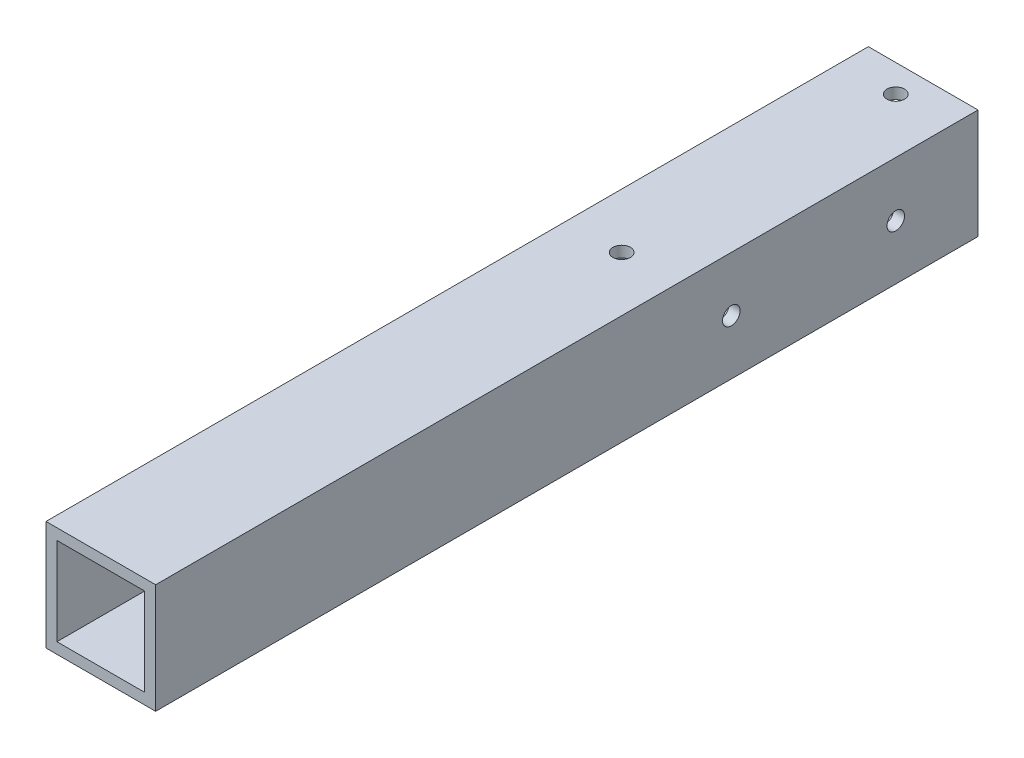
ISO-10303-21;
HEADER;
FILE_DESCRIPTION(('STEP AP214'),'2;1');
FILE_NAME('part.step','',(''),(''),'','','');
FILE_SCHEMA(('AUTOMOTIVE_DESIGN { 1 0 10303 214 1 1 1 1 }'));
ENDSEC;
DATA;
#1=APPLICATION_CONTEXT('core data for automotive mechanical design processes');
#2=APPLICATION_PROTOCOL_DEFINITION('international standard','automotive_design',2000,#1);
#3=PRODUCT_CONTEXT('',#1,'mechanical');
#4=PRODUCT('Part','Part','',(#3));
#5=PRODUCT_RELATED_PRODUCT_CATEGORY('part','',(#4));
#6=PRODUCT_DEFINITION_FORMATION('','',#4);
#7=PRODUCT_DEFINITION_CONTEXT('part definition',#1,'design');
#8=PRODUCT_DEFINITION('design','',#6,#7);
#9=PRODUCT_DEFINITION_SHAPE('','',#8);
#10=(LENGTH_UNIT() NAMED_UNIT(*) SI_UNIT(.MILLI.,.METRE.));
#11=(NAMED_UNIT(*) PLANE_ANGLE_UNIT() SI_UNIT($,.RADIAN.));
#12=(NAMED_UNIT(*) SI_UNIT($,.STERADIAN.) SOLID_ANGLE_UNIT());
#13=UNCERTAINTY_MEASURE_WITH_UNIT(LENGTH_MEASURE(1.E-05),#10,'distance_accuracy_value','');
#14=(GEOMETRIC_REPRESENTATION_CONTEXT(3) GLOBAL_UNCERTAINTY_ASSIGNED_CONTEXT((#13)) GLOBAL_UNIT_ASSIGNED_CONTEXT((#10,
#11,#12)) REPRESENTATION_CONTEXT('',''));
#15=CARTESIAN_POINT('',(0.,0.,0.));
#16=DIRECTION('',(0.,0.,1.));
#17=DIRECTION('',(1.,0.,0.));
#18=AXIS2_PLACEMENT_3D('',#15,#16,#17);
#19=CARTESIAN_POINT('',(0.,0.,150.));
#20=DIRECTION('',(0.,0.,1.));
#21=DIRECTION('',(1.,0.,0.));
#22=AXIS2_PLACEMENT_3D('',#19,#20,#21);
#23=PLANE('',#22);
#24=DIRECTION('',(0.,1.,0.));
#25=VECTOR('',#24,1.);
#26=CARTESIAN_POINT('',(10.,10.,150.));
#27=LINE('',#26,#25);
#28=CARTESIAN_POINT('',(10.,-10.,150.));
#29=VERTEX_POINT('',#28);
#30=CARTESIAN_POINT('',(10.,10.,150.));
#31=VERTEX_POINT('',#30);
#32=EDGE_CURVE('E138',#29,#31,#27,.T.);
#33=ORIENTED_EDGE('',*,*,#32,.T.);
#34=DIRECTION('',(-1.,0.,0.));
#35=VECTOR('',#34,1.);
#36=CARTESIAN_POINT('',(-10.,10.,150.));
#37=LINE('',#36,#35);
#38=CARTESIAN_POINT('',(-10.,10.,150.));
#39=VERTEX_POINT('',#38);
#40=EDGE_CURVE('E141',#31,#39,#37,.T.);
#41=ORIENTED_EDGE('',*,*,#40,.T.);
#42=DIRECTION('',(0.,-1.,0.));
#43=VECTOR('',#42,1.);
#44=CARTESIAN_POINT('',(-10.,10.,150.));
#45=LINE('',#44,#43);
#46=CARTESIAN_POINT('',(-10.,-10.,150.));
#47=VERTEX_POINT('',#46);
#48=EDGE_CURVE('E144',#39,#47,#45,.T.);
#49=ORIENTED_EDGE('',*,*,#48,.T.);
#50=DIRECTION('',(1.,0.,0.));
#51=VECTOR('',#50,1.);
#52=CARTESIAN_POINT('',(-10.,-10.,150.));
#53=LINE('',#52,#51);
#54=EDGE_CURVE('E146',#47,#29,#53,.T.);
#55=ORIENTED_EDGE('',*,*,#54,.T.);
#56=EDGE_LOOP('',(#33,#41,#49,#55));
#57=FACE_BOUND('',#56,.T.);
#58=DIRECTION('',(0.,-1.,0.));
#59=VECTOR('',#58,1.);
#60=CARTESIAN_POINT('',(-8.,8.,150.));
#61=LINE('',#60,#59);
#62=CARTESIAN_POINT('',(-8.,8.,150.));
#63=VERTEX_POINT('',#62);
#64=CARTESIAN_POINT('',(-8.,-7.99999999999999,150.));
#65=VERTEX_POINT('',#64);
#66=EDGE_CURVE('E108',#63,#65,#61,.T.);
#67=ORIENTED_EDGE('',*,*,#66,.F.);
#68=DIRECTION('',(-1.,0.,0.));
#69=VECTOR('',#68,1.);
#70=CARTESIAN_POINT('',(-8.,8.,150.));
#71=LINE('',#70,#69);
#72=CARTESIAN_POINT('',(8.,8.,150.));
#73=VERTEX_POINT('',#72);
#74=EDGE_CURVE('E100',#73,#63,#71,.T.);
#75=ORIENTED_EDGE('',*,*,#74,.F.);
#76=DIRECTION('',(0.,1.,0.));
#77=VECTOR('',#76,1.);
#78=CARTESIAN_POINT('',(8.,8.,150.));
#79=LINE('',#78,#77);
#80=CARTESIAN_POINT('',(8.,-7.99999999999999,150.));
#81=VERTEX_POINT('',#80);
#82=EDGE_CURVE('E122',#81,#73,#79,.T.);
#83=ORIENTED_EDGE('',*,*,#82,.F.);
#84=DIRECTION('',(1.,0.,0.));
#85=VECTOR('',#84,1.);
#86=CARTESIAN_POINT('',(-8.,-7.99999999999999,150.));
#87=LINE('',#86,#85);
#88=EDGE_CURVE('E120',#65,#81,#87,.T.);
#89=ORIENTED_EDGE('',*,*,#88,.F.);
#90=EDGE_LOOP('',(#67,#75,#83,#89));
#91=FACE_BOUND('',#90,.T.);
#92=ADVANCED_FACE('F33',(#57,#91),#23,.T.);
#93=CARTESIAN_POINT('',(0.,0.,0.));
#94=DIRECTION('',(0.,0.,1.));
#95=DIRECTION('',(1.,0.,0.));
#96=AXIS2_PLACEMENT_3D('',#93,#94,#95);
#97=PLANE('',#96);
#98=DIRECTION('',(0.,1.,0.));
#99=VECTOR('',#98,1.);
#100=CARTESIAN_POINT('',(10.,10.,0.));
#101=LINE('',#100,#99);
#102=CARTESIAN_POINT('',(10.,-10.,0.));
#103=VERTEX_POINT('',#102);
#104=CARTESIAN_POINT('',(10.,10.,0.));
#105=VERTEX_POINT('',#104);
#106=EDGE_CURVE('E116',#103,#105,#101,.T.);
#107=ORIENTED_EDGE('',*,*,#106,.F.);
#108=DIRECTION('',(1.,0.,0.));
#109=VECTOR('',#108,1.);
#110=CARTESIAN_POINT('',(-10.,-10.,0.));
#111=LINE('',#110,#109);
#112=CARTESIAN_POINT('',(-10.,-10.,0.));
#113=VERTEX_POINT('',#112);
#114=EDGE_CURVE('E142',#113,#103,#111,.T.);
#115=ORIENTED_EDGE('',*,*,#114,.F.);
#116=DIRECTION('',(0.,-1.,0.));
#117=VECTOR('',#116,1.);
#118=CARTESIAN_POINT('',(-10.,10.,0.));
#119=LINE('',#118,#117);
#120=CARTESIAN_POINT('',(-10.,10.,0.));
#121=VERTEX_POINT('',#120);
#122=EDGE_CURVE('E153',#121,#113,#119,.T.);
#123=ORIENTED_EDGE('',*,*,#122,.F.);
#124=DIRECTION('',(-1.,0.,0.));
#125=VECTOR('',#124,1.);
#126=CARTESIAN_POINT('',(-10.,10.,0.));
#127=LINE('',#126,#125);
#128=EDGE_CURVE('E151',#105,#121,#127,.T.);
#129=ORIENTED_EDGE('',*,*,#128,.F.);
#130=EDGE_LOOP('',(#107,#115,#123,#129));
#131=FACE_BOUND('',#130,.T.);
#132=DIRECTION('',(-1.,0.,0.));
#133=VECTOR('',#132,1.);
#134=CARTESIAN_POINT('',(-8.,8.,0.));
#135=LINE('',#134,#133);
#136=CARTESIAN_POINT('',(8.,8.,0.));
#137=VERTEX_POINT('',#136);
#138=CARTESIAN_POINT('',(-8.,8.,0.));
#139=VERTEX_POINT('',#138);
#140=EDGE_CURVE('E58',#137,#139,#135,.T.);
#141=ORIENTED_EDGE('',*,*,#140,.T.);
#142=DIRECTION('',(0.,-1.,0.));
#143=VECTOR('',#142,1.);
#144=CARTESIAN_POINT('',(-8.,8.,0.));
#145=LINE('',#144,#143);
#146=CARTESIAN_POINT('',(-8.,-7.99999999999999,0.));
#147=VERTEX_POINT('',#146);
#148=EDGE_CURVE('E115',#139,#147,#145,.T.);
#149=ORIENTED_EDGE('',*,*,#148,.T.);
#150=DIRECTION('',(1.,0.,0.));
#151=VECTOR('',#150,1.);
#152=CARTESIAN_POINT('',(-8.,-7.99999999999999,0.));
#153=LINE('',#152,#151);
#154=CARTESIAN_POINT('',(8.,-7.99999999999999,0.));
#155=VERTEX_POINT('',#154);
#156=EDGE_CURVE('E130',#147,#155,#153,.T.);
#157=ORIENTED_EDGE('',*,*,#156,.T.);
#158=DIRECTION('',(0.,1.,0.));
#159=VECTOR('',#158,1.);
#160=CARTESIAN_POINT('',(8.,8.,0.));
#161=LINE('',#160,#159);
#162=EDGE_CURVE('E109',#155,#137,#161,.T.);
#163=ORIENTED_EDGE('',*,*,#162,.T.);
#164=EDGE_LOOP('',(#141,#149,#157,#163));
#165=FACE_BOUND('',#164,.T.);
#166=ADVANCED_FACE('F218',(#131,#165),#97,.F.);
#167=CARTESIAN_POINT('',(10.,10.,150.));
#168=DIRECTION('',(-1.,0.,0.));
#169=DIRECTION('',(0.,-1.,0.));
#170=AXIS2_PLACEMENT_3D('',#167,#168,#169);
#171=PLANE('',#170);
#172=CARTESIAN_POINT('',(10.,0.,45.));
#173=DIRECTION('',(1.,0.,0.));
#174=DIRECTION('',(0.,1.,0.));
#175=AXIS2_PLACEMENT_3D('',#172,#173,#174);
#176=CIRCLE('',#175,1.6);
#177=CARTESIAN_POINT('',(10.,1.6,45.));
#178=VERTEX_POINT('',#177);
#179=EDGE_CURVE('E184',#178,#178,#176,.T.);
#180=ORIENTED_EDGE('',*,*,#179,.F.);
#181=EDGE_LOOP('',(#180));
#182=FACE_BOUND('',#181,.T.);
#183=CARTESIAN_POINT('',(10.,0.,15.));
#184=DIRECTION('',(1.,0.,0.));
#185=DIRECTION('',(0.,1.,0.));
#186=AXIS2_PLACEMENT_3D('',#183,#184,#185);
#187=CIRCLE('',#186,1.6);
#188=CARTESIAN_POINT('',(10.,1.6,15.));
#189=VERTEX_POINT('',#188);
#190=EDGE_CURVE('E174',#189,#189,#187,.T.);
#191=ORIENTED_EDGE('',*,*,#190,.F.);
#192=EDGE_LOOP('',(#191));
#193=FACE_BOUND('',#192,.T.);
#194=ORIENTED_EDGE('',*,*,#106,.T.);
#195=DIRECTION('',(0.,0.,-1.));
#196=VECTOR('',#195,1.);
#197=CARTESIAN_POINT('',(10.,10.,150.));
#198=LINE('',#197,#196);
#199=EDGE_CURVE('E11',#31,#105,#198,.T.);
#200=ORIENTED_EDGE('',*,*,#199,.F.);
#201=ORIENTED_EDGE('',*,*,#32,.F.);
#202=DIRECTION('',(0.,0.,-1.));
#203=VECTOR('',#202,1.);
#204=CARTESIAN_POINT('',(10.,-10.,150.));
#205=LINE('',#204,#203);
#206=EDGE_CURVE('E148',#29,#103,#205,.T.);
#207=ORIENTED_EDGE('',*,*,#206,.T.);
#208=EDGE_LOOP('',(#194,#200,#201,#207));
#209=FACE_BOUND('',#208,.T.);
#210=ADVANCED_FACE('F35',(#182,#193,#209),#171,.F.);
#211=CARTESIAN_POINT('',(-10.,10.,150.));
#212=DIRECTION('',(0.,-1.,0.));
#213=DIRECTION('',(0.,0.,-1.));
#214=AXIS2_PLACEMENT_3D('',#211,#212,#213);
#215=PLANE('',#214);
#216=CARTESIAN_POINT('',(0.,10.,55.));
#217=DIRECTION('',(0.,1.,0.));
#218=DIRECTION('',(0.,0.,1.));
#219=AXIS2_PLACEMENT_3D('',#216,#217,#218);
#220=CIRCLE('',#219,1.6);
#221=CARTESIAN_POINT('',(0.,10.,56.6));
#222=VERTEX_POINT('',#221);
#223=EDGE_CURVE('E171',#222,#222,#220,.T.);
#224=ORIENTED_EDGE('',*,*,#223,.F.);
#225=EDGE_LOOP('',(#224));
#226=FACE_BOUND('',#225,.T.);
#227=CARTESIAN_POINT('',(0.,10.,5.));
#228=DIRECTION('',(0.,1.,0.));
#229=DIRECTION('',(0.,0.,1.));
#230=AXIS2_PLACEMENT_3D('',#227,#228,#229);
#231=CIRCLE('',#230,1.6);
#232=CARTESIAN_POINT('',(0.,10.,6.6));
#233=VERTEX_POINT('',#232);
#234=EDGE_CURVE('E167',#233,#233,#231,.T.);
#235=ORIENTED_EDGE('',*,*,#234,.F.);
#236=EDGE_LOOP('',(#235));
#237=FACE_BOUND('',#236,.T.);
#238=ORIENTED_EDGE('',*,*,#128,.T.);
#239=DIRECTION('',(0.,0.,-1.));
#240=VECTOR('',#239,1.);
#241=CARTESIAN_POINT('',(-10.,10.,150.));
#242=LINE('',#241,#240);
#243=EDGE_CURVE('E42',#39,#121,#242,.T.);
#244=ORIENTED_EDGE('',*,*,#243,.F.);
#245=ORIENTED_EDGE('',*,*,#40,.F.);
#246=ORIENTED_EDGE('',*,*,#199,.T.);
#247=EDGE_LOOP('',(#238,#244,#245,#246));
#248=FACE_BOUND('',#247,.T.);
#249=ADVANCED_FACE('F234',(#226,#237,#248),#215,.F.);
#250=CARTESIAN_POINT('',(-10.,10.,150.));
#251=DIRECTION('',(1.,0.,0.));
#252=DIRECTION('',(0.,1.,0.));
#253=AXIS2_PLACEMENT_3D('',#250,#251,#252);
#254=PLANE('',#253);
#255=ORIENTED_EDGE('',*,*,#122,.T.);
#256=DIRECTION('',(0.,0.,-1.));
#257=VECTOR('',#256,1.);
#258=CARTESIAN_POINT('',(-10.,-10.,150.));
#259=LINE('',#258,#257);
#260=EDGE_CURVE('E158',#47,#113,#259,.T.);
#261=ORIENTED_EDGE('',*,*,#260,.F.);
#262=ORIENTED_EDGE('',*,*,#48,.F.);
#263=ORIENTED_EDGE('',*,*,#243,.T.);
#264=EDGE_LOOP('',(#255,#261,#262,#263));
#265=FACE_BOUND('',#264,.T.);
#266=ADVANCED_FACE('F231',(#265),#254,.F.);
#267=CARTESIAN_POINT('',(-10.,-10.,150.));
#268=DIRECTION('',(0.,1.,0.));
#269=DIRECTION('',(0.,0.,1.));
#270=AXIS2_PLACEMENT_3D('',#267,#268,#269);
#271=PLANE('',#270);
#272=CARTESIAN_POINT('',(0.,-10.,55.));
#273=DIRECTION('',(0.,1.,0.));
#274=DIRECTION('',(0.,0.,1.));
#275=AXIS2_PLACEMENT_3D('',#272,#273,#274);
#276=CIRCLE('',#275,1.6);
#277=CARTESIAN_POINT('',(0.,-10.,56.6));
#278=VERTEX_POINT('',#277);
#279=EDGE_CURVE('E189',#278,#278,#276,.T.);
#280=ORIENTED_EDGE('',*,*,#279,.T.);
#281=EDGE_LOOP('',(#280));
#282=FACE_BOUND('',#281,.T.);
#283=CARTESIAN_POINT('',(0.,-10.,5.));
#284=DIRECTION('',(0.,1.,0.));
#285=DIRECTION('',(0.,0.,1.));
#286=AXIS2_PLACEMENT_3D('',#283,#284,#285);
#287=CIRCLE('',#286,1.6);
#288=CARTESIAN_POINT('',(0.,-10.,6.6));
#289=VERTEX_POINT('',#288);
#290=EDGE_CURVE('E128',#289,#289,#287,.T.);
#291=ORIENTED_EDGE('',*,*,#290,.T.);
#292=EDGE_LOOP('',(#291));
#293=FACE_BOUND('',#292,.T.);
#294=ORIENTED_EDGE('',*,*,#114,.T.);
#295=ORIENTED_EDGE('',*,*,#206,.F.);
#296=ORIENTED_EDGE('',*,*,#54,.F.);
#297=ORIENTED_EDGE('',*,*,#260,.T.);
#298=EDGE_LOOP('',(#294,#295,#296,#297));
#299=FACE_BOUND('',#298,.T.);
#300=ADVANCED_FACE('F198',(#282,#293,#299),#271,.F.);
#301=CARTESIAN_POINT('',(-8.,8.,150.));
#302=DIRECTION('',(0.,-1.,0.));
#303=DIRECTION('',(0.,0.,-1.));
#304=AXIS2_PLACEMENT_3D('',#301,#302,#303);
#305=PLANE('',#304);
#306=CARTESIAN_POINT('',(0.,8.00000000000001,55.));
#307=DIRECTION('',(0.,-1.,0.));
#308=DIRECTION('',(0.,0.,-1.));
#309=AXIS2_PLACEMENT_3D('',#306,#307,#308);
#310=CIRCLE('',#309,1.6);
#311=CARTESIAN_POINT('',(0.,8.00000000000001,53.4));
#312=VERTEX_POINT('',#311);
#313=EDGE_CURVE('E170',#312,#312,#310,.T.);
#314=ORIENTED_EDGE('',*,*,#313,.F.);
#315=EDGE_LOOP('',(#314));
#316=FACE_BOUND('',#315,.T.);
#317=CARTESIAN_POINT('',(0.,8.00000000000001,5.));
#318=DIRECTION('',(0.,-1.,0.));
#319=DIRECTION('',(0.,0.,-1.));
#320=AXIS2_PLACEMENT_3D('',#317,#318,#319);
#321=CIRCLE('',#320,1.6);
#322=CARTESIAN_POINT('',(0.,8.00000000000001,3.4));
#323=VERTEX_POINT('',#322);
#324=EDGE_CURVE('E166',#323,#323,#321,.T.);
#325=ORIENTED_EDGE('',*,*,#324,.F.);
#326=EDGE_LOOP('',(#325));
#327=FACE_BOUND('',#326,.T.);
#328=ORIENTED_EDGE('',*,*,#140,.F.);
#329=DIRECTION('',(0.,0.,-1.));
#330=VECTOR('',#329,1.);
#331=CARTESIAN_POINT('',(8.,8.,150.));
#332=LINE('',#331,#330);
#333=EDGE_CURVE('E104',#73,#137,#332,.T.);
#334=ORIENTED_EDGE('',*,*,#333,.F.);
#335=ORIENTED_EDGE('',*,*,#74,.T.);
#336=DIRECTION('',(0.,0.,-1.));
#337=VECTOR('',#336,1.);
#338=CARTESIAN_POINT('',(-8.,8.,150.));
#339=LINE('',#338,#337);
#340=EDGE_CURVE('E103',#63,#139,#339,.T.);
#341=ORIENTED_EDGE('',*,*,#340,.T.);
#342=EDGE_LOOP('',(#328,#334,#335,#341));
#343=FACE_BOUND('',#342,.T.);
#344=ADVANCED_FACE('F102',(#316,#327,#343),#305,.T.);
#345=CARTESIAN_POINT('',(-8.,8.,150.));
#346=DIRECTION('',(1.,0.,0.));
#347=DIRECTION('',(0.,1.,0.));
#348=AXIS2_PLACEMENT_3D('',#345,#346,#347);
#349=PLANE('',#348);
#350=ORIENTED_EDGE('',*,*,#148,.F.);
#351=ORIENTED_EDGE('',*,*,#340,.F.);
#352=ORIENTED_EDGE('',*,*,#66,.T.);
#353=DIRECTION('',(0.,0.,-1.));
#354=VECTOR('',#353,1.);
#355=CARTESIAN_POINT('',(-8.,-7.99999999999999,150.));
#356=LINE('',#355,#354);
#357=EDGE_CURVE('E117',#65,#147,#356,.T.);
#358=ORIENTED_EDGE('',*,*,#357,.T.);
#359=EDGE_LOOP('',(#350,#351,#352,#358));
#360=FACE_BOUND('',#359,.T.);
#361=ADVANCED_FACE('F112',(#360),#349,.T.);
#362=CARTESIAN_POINT('',(-8.,-7.99999999999999,150.));
#363=DIRECTION('',(0.,1.,0.));
#364=DIRECTION('',(0.,0.,1.));
#365=AXIS2_PLACEMENT_3D('',#362,#363,#364);
#366=PLANE('',#365);
#367=CARTESIAN_POINT('',(0.,-8.00000000000001,55.));
#368=DIRECTION('',(0.,1.,0.));
#369=DIRECTION('',(0.,0.,1.));
#370=AXIS2_PLACEMENT_3D('',#367,#368,#369);
#371=CIRCLE('',#370,1.6);
#372=CARTESIAN_POINT('',(0.,-8.00000000000001,56.6));
#373=VERTEX_POINT('',#372);
#374=EDGE_CURVE('E168',#373,#373,#371,.T.);
#375=ORIENTED_EDGE('',*,*,#374,.F.);
#376=EDGE_LOOP('',(#375));
#377=FACE_BOUND('',#376,.T.);
#378=CARTESIAN_POINT('',(0.,-8.00000000000001,5.));
#379=DIRECTION('',(0.,1.,0.));
#380=DIRECTION('',(0.,0.,1.));
#381=AXIS2_PLACEMENT_3D('',#378,#379,#380);
#382=CIRCLE('',#381,1.6);
#383=CARTESIAN_POINT('',(0.,-8.00000000000001,6.6));
#384=VERTEX_POINT('',#383);
#385=EDGE_CURVE('E163',#384,#384,#382,.T.);
#386=ORIENTED_EDGE('',*,*,#385,.F.);
#387=EDGE_LOOP('',(#386));
#388=FACE_BOUND('',#387,.T.);
#389=ORIENTED_EDGE('',*,*,#156,.F.);
#390=ORIENTED_EDGE('',*,*,#357,.F.);
#391=ORIENTED_EDGE('',*,*,#88,.T.);
#392=DIRECTION('',(0.,0.,-1.));
#393=VECTOR('',#392,1.);
#394=CARTESIAN_POINT('',(8.,-7.99999999999999,150.));
#395=LINE('',#394,#393);
#396=EDGE_CURVE('E50',#81,#155,#395,.T.);
#397=ORIENTED_EDGE('',*,*,#396,.T.);
#398=EDGE_LOOP('',(#389,#390,#391,#397));
#399=FACE_BOUND('',#398,.T.);
#400=ADVANCED_FACE('F213',(#377,#388,#399),#366,.T.);
#401=CARTESIAN_POINT('',(8.,8.,150.));
#402=DIRECTION('',(-1.,0.,0.));
#403=DIRECTION('',(0.,0.,1.));
#404=AXIS2_PLACEMENT_3D('',#401,#402,#403);
#405=PLANE('',#404);
#406=CARTESIAN_POINT('',(8.,0.,45.));
#407=DIRECTION('',(-1.,0.,0.));
#408=DIRECTION('',(0.,0.,1.));
#409=AXIS2_PLACEMENT_3D('',#406,#407,#408);
#410=CIRCLE('',#409,1.6);
#411=CARTESIAN_POINT('',(8.,0.,46.6));
#412=VERTEX_POINT('',#411);
#413=EDGE_CURVE('E37',#412,#412,#410,.T.);
#414=ORIENTED_EDGE('',*,*,#413,.F.);
#415=EDGE_LOOP('',(#414));
#416=FACE_BOUND('',#415,.T.);
#417=CARTESIAN_POINT('',(8.,0.,15.));
#418=DIRECTION('',(-1.,0.,0.));
#419=DIRECTION('',(0.,0.,1.));
#420=AXIS2_PLACEMENT_3D('',#417,#418,#419);
#421=CIRCLE('',#420,1.6);
#422=CARTESIAN_POINT('',(8.,0.,16.6));
#423=VERTEX_POINT('',#422);
#424=EDGE_CURVE('E172',#423,#423,#421,.T.);
#425=ORIENTED_EDGE('',*,*,#424,.F.);
#426=EDGE_LOOP('',(#425));
#427=FACE_BOUND('',#426,.T.);
#428=ORIENTED_EDGE('',*,*,#162,.F.);
#429=ORIENTED_EDGE('',*,*,#396,.F.);
#430=ORIENTED_EDGE('',*,*,#82,.T.);
#431=ORIENTED_EDGE('',*,*,#333,.T.);
#432=EDGE_LOOP('',(#428,#429,#430,#431));
#433=FACE_BOUND('',#432,.T.);
#434=ADVANCED_FACE('F204',(#416,#427,#433),#405,.T.);
#435=CARTESIAN_POINT('',(0.,-398.37168574,5.));
#436=DIRECTION('',(0.,1.,0.));
#437=DIRECTION('',(0.,0.,1.));
#438=AXIS2_PLACEMENT_3D('',#435,#436,#437);
#439=CYLINDRICAL_SURFACE('',#438,1.6);
#440=ORIENTED_EDGE('',*,*,#385,.T.);
#441=EDGE_LOOP('',(#440));
#442=FACE_BOUND('',#441,.T.);
#443=ORIENTED_EDGE('',*,*,#290,.F.);
#444=EDGE_LOOP('',(#443));
#445=FACE_BOUND('',#444,.T.);
#446=ADVANCED_FACE('F201',(#442,#445),#439,.F.);
#447=ORIENTED_EDGE('',*,*,#324,.T.);
#448=EDGE_LOOP('',(#447));
#449=FACE_BOUND('',#448,.T.);
#450=ORIENTED_EDGE('',*,*,#234,.T.);
#451=EDGE_LOOP('',(#450));
#452=FACE_BOUND('',#451,.T.);
#453=ADVANCED_FACE('F203',(#449,#452),#439,.F.);
#454=CARTESIAN_POINT('',(0.,-398.37168574,55.));
#455=DIRECTION('',(0.,1.,0.));
#456=DIRECTION('',(0.,0.,1.));
#457=AXIS2_PLACEMENT_3D('',#454,#455,#456);
#458=CYLINDRICAL_SURFACE('',#457,1.6);
#459=ORIENTED_EDGE('',*,*,#374,.T.);
#460=EDGE_LOOP('',(#459));
#461=FACE_BOUND('',#460,.T.);
#462=ORIENTED_EDGE('',*,*,#279,.F.);
#463=EDGE_LOOP('',(#462));
#464=FACE_BOUND('',#463,.T.);
#465=ADVANCED_FACE('F211',(#461,#464),#458,.F.);
#466=ORIENTED_EDGE('',*,*,#313,.T.);
#467=EDGE_LOOP('',(#466));
#468=FACE_BOUND('',#467,.T.);
#469=ORIENTED_EDGE('',*,*,#223,.T.);
#470=EDGE_LOOP('',(#469));
#471=FACE_BOUND('',#470,.T.);
#472=ADVANCED_FACE('F272',(#468,#471),#458,.F.);
#473=CARTESIAN_POINT('',(0.,0.,15.));
#474=DIRECTION('',(1.,0.,0.));
#475=DIRECTION('',(0.,1.,0.));
#476=AXIS2_PLACEMENT_3D('',#473,#474,#475);
#477=CYLINDRICAL_SURFACE('',#476,1.6);
#478=ORIENTED_EDGE('',*,*,#424,.T.);
#479=EDGE_LOOP('',(#478));
#480=FACE_BOUND('',#479,.T.);
#481=ORIENTED_EDGE('',*,*,#190,.T.);
#482=EDGE_LOOP('',(#481));
#483=FACE_BOUND('',#482,.T.);
#484=ADVANCED_FACE('F277',(#480,#483),#477,.F.);
#485=CARTESIAN_POINT('',(0.,0.,45.));
#486=DIRECTION('',(1.,0.,0.));
#487=DIRECTION('',(0.,1.,0.));
#488=AXIS2_PLACEMENT_3D('',#485,#486,#487);
#489=CYLINDRICAL_SURFACE('',#488,1.6);
#490=ORIENTED_EDGE('',*,*,#413,.T.);
#491=EDGE_LOOP('',(#490));
#492=FACE_BOUND('',#491,.T.);
#493=ORIENTED_EDGE('',*,*,#179,.T.);
#494=EDGE_LOOP('',(#493));
#495=FACE_BOUND('',#494,.T.);
#496=ADVANCED_FACE('F282',(#492,#495),#489,.F.);
#497=CLOSED_SHELL('',(#92,#166,#210,#249,#266,#300,#344,#361,#400,#434,#446,#453,#465,#472,#484,#496));
#498=MANIFOLD_SOLID_BREP('B2',#497);
#499=ADVANCED_BREP_SHAPE_REPRESENTATION('',(#18,#498),#14);
#500=SHAPE_DEFINITION_REPRESENTATION(#9,#499);
ENDSEC;
END-ISO-10303-21;
